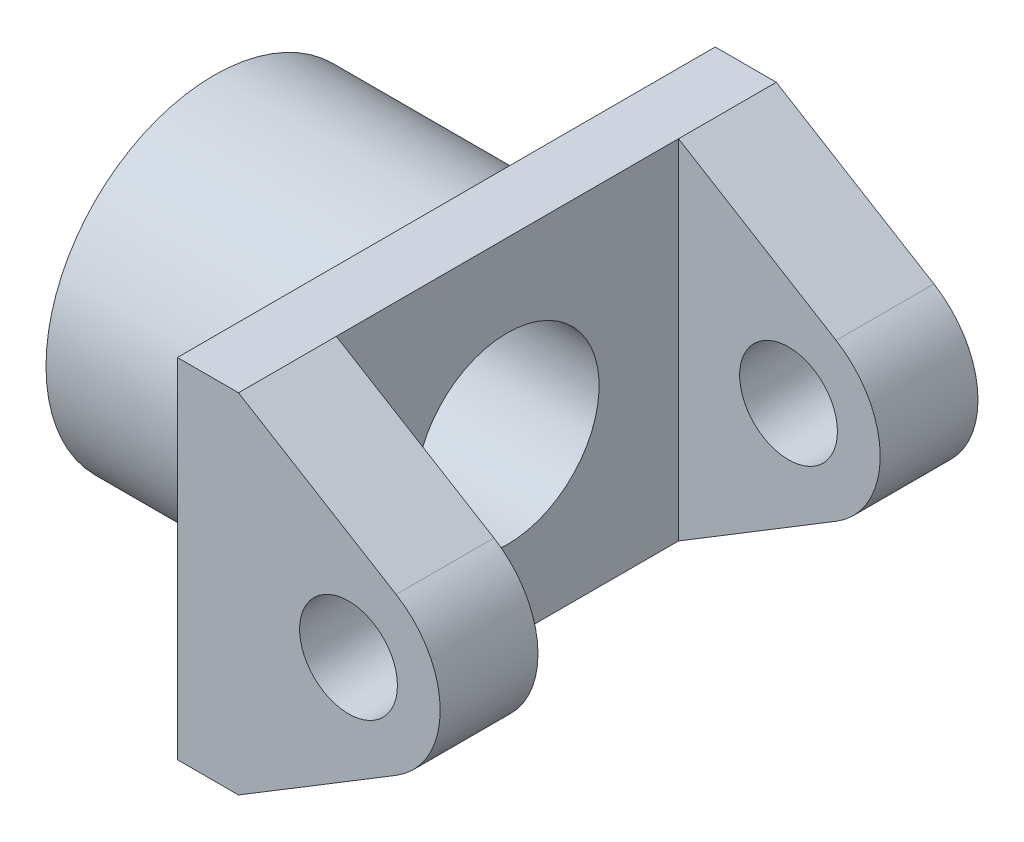
ISO-10303-21;
HEADER;
FILE_DESCRIPTION(('STEP AP214'),'2;1');
FILE_NAME('part.step','',(''),(''),'','','');
FILE_SCHEMA(('AUTOMOTIVE_DESIGN { 1 0 10303 214 1 1 1 1 }'));
ENDSEC;
DATA;
#1=APPLICATION_CONTEXT('core data for automotive mechanical design processes');
#2=APPLICATION_PROTOCOL_DEFINITION('international standard','automotive_design',2000,#1);
#3=PRODUCT_CONTEXT('',#1,'mechanical');
#4=PRODUCT('Part','Part','',(#3));
#5=PRODUCT_RELATED_PRODUCT_CATEGORY('part','',(#4));
#6=PRODUCT_DEFINITION_FORMATION('','',#4);
#7=PRODUCT_DEFINITION_CONTEXT('part definition',#1,'design');
#8=PRODUCT_DEFINITION('design','',#6,#7);
#9=PRODUCT_DEFINITION_SHAPE('','',#8);
#10=(LENGTH_UNIT() NAMED_UNIT(*) SI_UNIT(.MILLI.,.METRE.));
#11=(NAMED_UNIT(*) PLANE_ANGLE_UNIT() SI_UNIT($,.RADIAN.));
#12=(NAMED_UNIT(*) SI_UNIT($,.STERADIAN.) SOLID_ANGLE_UNIT());
#13=UNCERTAINTY_MEASURE_WITH_UNIT(LENGTH_MEASURE(1.E-05),#10,'distance_accuracy_value','');
#14=(GEOMETRIC_REPRESENTATION_CONTEXT(3) GLOBAL_UNCERTAINTY_ASSIGNED_CONTEXT((#13)) GLOBAL_UNIT_ASSIGNED_CONTEXT((#10,
#11,#12)) REPRESENTATION_CONTEXT('',''));
#15=CARTESIAN_POINT('',(0.,0.,0.));
#16=DIRECTION('',(0.,0.,1.));
#17=DIRECTION('',(1.,0.,0.));
#18=AXIS2_PLACEMENT_3D('',#15,#16,#17);
#19=CARTESIAN_POINT('',(-28.,0.,-16.));
#20=DIRECTION('',(-1.,0.,0.));
#21=DIRECTION('',(0.,0.,1.));
#22=AXIS2_PLACEMENT_3D('',#19,#20,#21);
#23=PLANE('',#22);
#24=DIRECTION('',(0.,0.,1.));
#25=VECTOR('',#24,1.);
#26=CARTESIAN_POINT('',(-28.,-28.5,-16.));
#27=LINE('',#26,#25);
#28=CARTESIAN_POINT('',(-28.,-28.5,-16.));
#29=VERTEX_POINT('',#28);
#30=CARTESIAN_POINT('',(-28.,-28.5,72.));
#31=VERTEX_POINT('',#30);
#32=EDGE_CURVE('E113',#29,#31,#27,.T.);
#33=ORIENTED_EDGE('',*,*,#32,.T.);
#34=DIRECTION('',(0.,1.,0.));
#35=VECTOR('',#34,1.);
#36=CARTESIAN_POINT('',(-28.,28.5,72.));
#37=LINE('',#36,#35);
#38=CARTESIAN_POINT('',(-28.,28.5,72.));
#39=VERTEX_POINT('',#38);
#40=EDGE_CURVE('E109',#31,#39,#37,.T.);
#41=ORIENTED_EDGE('',*,*,#40,.T.);
#42=DIRECTION('',(0.,0.,1.));
#43=VECTOR('',#42,1.);
#44=CARTESIAN_POINT('',(-28.,28.5,-16.));
#45=LINE('',#44,#43);
#46=CARTESIAN_POINT('',(-28.,28.5,-16.));
#47=VERTEX_POINT('',#46);
#48=EDGE_CURVE('E101',#47,#39,#45,.T.);
#49=ORIENTED_EDGE('',*,*,#48,.F.);
#50=DIRECTION('',(0.,-1.,0.));
#51=VECTOR('',#50,1.);
#52=CARTESIAN_POINT('',(-28.,0.,-16.));
#53=LINE('',#52,#51);
#54=EDGE_CURVE('E106',#47,#29,#53,.T.);
#55=ORIENTED_EDGE('',*,*,#54,.T.);
#56=EDGE_LOOP('',(#33,#41,#49,#55));
#57=FACE_BOUND('',#56,.T.);
#58=CARTESIAN_POINT('',(-28.,0.,28.));
#59=DIRECTION('',(-1.,0.,0.));
#60=DIRECTION('',(0.,0.,1.));
#61=AXIS2_PLACEMENT_3D('',#58,#59,#60);
#62=CIRCLE('',#61,27.5);
#63=CARTESIAN_POINT('',(-28.,0.,55.5));
#64=VERTEX_POINT('',#63);
#65=EDGE_CURVE('E245',#64,#64,#62,.T.);
#66=ORIENTED_EDGE('',*,*,#65,.F.);
#67=EDGE_LOOP('',(#66));
#68=FACE_BOUND('',#67,.T.);
#69=ADVANCED_FACE('F35',(#57,#68),#23,.T.);
#70=CARTESIAN_POINT('',(-18.,0.,0.));
#71=DIRECTION('',(-1.,0.,0.));
#72=DIRECTION('',(0.,0.,1.));
#73=AXIS2_PLACEMENT_3D('',#70,#71,#72);
#74=PLANE('',#73);
#75=CARTESIAN_POINT('',(-18.,0.,28.));
#76=DIRECTION('',(1.,0.,0.));
#77=DIRECTION('',(0.,0.,-1.));
#78=AXIS2_PLACEMENT_3D('',#75,#76,#77);
#79=CIRCLE('',#78,15.);
#80=CARTESIAN_POINT('',(-18.,-4.,42.456832294801));
#81=VERTEX_POINT('',#80);
#82=CARTESIAN_POINT('',(-18.,4.,42.456832294801));
#83=VERTEX_POINT('',#82);
#84=EDGE_CURVE('E326',#81,#83,#79,.T.);
#85=ORIENTED_EDGE('',*,*,#84,.F.);
#86=DIRECTION('',(0.,0.,-1.));
#87=VECTOR('',#86,1.);
#88=CARTESIAN_POINT('',(-18.,-4.,42.456832294801));
#89=LINE('',#88,#87);
#90=CARTESIAN_POINT('',(-18.,-4.,47.));
#91=VERTEX_POINT('',#90);
#92=EDGE_CURVE('E329',#91,#81,#89,.T.);
#93=ORIENTED_EDGE('',*,*,#92,.F.);
#94=DIRECTION('',(0.,-1.,0.));
#95=VECTOR('',#94,1.);
#96=CARTESIAN_POINT('',(-18.,-4.,47.));
#97=LINE('',#96,#95);
#98=CARTESIAN_POINT('',(-18.,4.,47.));
#99=VERTEX_POINT('',#98);
#100=EDGE_CURVE('E332',#99,#91,#97,.T.);
#101=ORIENTED_EDGE('',*,*,#100,.F.);
#102=DIRECTION('',(0.,0.,1.));
#103=VECTOR('',#102,1.);
#104=CARTESIAN_POINT('',(-18.,4.,47.));
#105=LINE('',#104,#103);
#106=EDGE_CURVE('E318',#83,#99,#105,.T.);
#107=ORIENTED_EDGE('',*,*,#106,.F.);
#108=EDGE_LOOP('',(#85,#93,#101,#107));
#109=FACE_BOUND('',#108,.T.);
#110=DIRECTION('',(0.,-1.,0.));
#111=VECTOR('',#110,1.);
#112=CARTESIAN_POINT('',(-18.,28.5,56.));
#113=LINE('',#112,#111);
#114=CARTESIAN_POINT('',(-18.,28.5,56.));
#115=VERTEX_POINT('',#114);
#116=CARTESIAN_POINT('',(-18.,-28.5,56.));
#117=VERTEX_POINT('',#116);
#118=EDGE_CURVE('E209',#115,#117,#113,.T.);
#119=ORIENTED_EDGE('',*,*,#118,.T.);
#120=DIRECTION('',(0.,0.,1.));
#121=VECTOR('',#120,1.);
#122=CARTESIAN_POINT('',(-18.,-28.5,-16.));
#123=LINE('',#122,#121);
#124=CARTESIAN_POINT('',(-18.,-28.5,0.));
#125=VERTEX_POINT('',#124);
#126=EDGE_CURVE('E206',#125,#117,#123,.T.);
#127=ORIENTED_EDGE('',*,*,#126,.F.);
#128=DIRECTION('',(0.,-1.,0.));
#129=VECTOR('',#128,1.);
#130=CARTESIAN_POINT('',(-18.,0.,0.));
#131=LINE('',#130,#129);
#132=CARTESIAN_POINT('',(-18.,28.5,0.));
#133=VERTEX_POINT('',#132);
#134=EDGE_CURVE('E11',#133,#125,#131,.T.);
#135=ORIENTED_EDGE('',*,*,#134,.F.);
#136=DIRECTION('',(0.,0.,-1.));
#137=VECTOR('',#136,1.);
#138=CARTESIAN_POINT('',(-18.,28.5,-16.));
#139=LINE('',#138,#137);
#140=EDGE_CURVE('E203',#115,#133,#139,.T.);
#141=ORIENTED_EDGE('',*,*,#140,.F.);
#142=EDGE_LOOP('',(#119,#127,#135,#141));
#143=FACE_BOUND('',#142,.T.);
#144=ADVANCED_FACE('F156',(#109,#143),#74,.F.);
#145=CARTESIAN_POINT('',(0.,0.,0.));
#146=DIRECTION('',(0.,0.,1.));
#147=DIRECTION('',(1.,0.,0.));
#148=AXIS2_PLACEMENT_3D('',#145,#146,#147);
#149=PLANE('',#148);
#150=CARTESIAN_POINT('',(0.,0.,0.));
#151=DIRECTION('',(0.,0.,1.));
#152=DIRECTION('',(1.,0.,0.));
#153=AXIS2_PLACEMENT_3D('',#150,#151,#152);
#154=CIRCLE('',#153,8.);
#155=CARTESIAN_POINT('',(8.,0.,0.));
#156=VERTEX_POINT('',#155);
#157=EDGE_CURVE('E132',#156,#156,#154,.T.);
#158=ORIENTED_EDGE('',*,*,#157,.F.);
#159=EDGE_LOOP('',(#158));
#160=FACE_BOUND('',#159,.T.);
#161=DIRECTION('',(0.854446220930648,-0.519539849806859,0.));
#162=VECTOR('',#161,1.);
#163=CARTESIAN_POINT('',(7.79309774710289,12.8166933139597,0.));
#164=LINE('',#163,#162);
#165=CARTESIAN_POINT('',(7.79309774710289,12.8166933139597,0.));
#166=VERTEX_POINT('',#165);
#167=EDGE_CURVE('E141',#133,#166,#164,.T.);
#168=ORIENTED_EDGE('',*,*,#167,.F.);
#169=ORIENTED_EDGE('',*,*,#134,.T.);
#170=DIRECTION('',(0.854446220930648,0.51953984980686,0.));
#171=VECTOR('',#170,1.);
#172=CARTESIAN_POINT('',(7.79309774710289,-12.8166933139597,0.));
#173=LINE('',#172,#171);
#174=CARTESIAN_POINT('',(7.79309774710289,-12.8166933139597,0.));
#175=VERTEX_POINT('',#174);
#176=EDGE_CURVE('E135',#125,#175,#173,.T.);
#177=ORIENTED_EDGE('',*,*,#176,.T.);
#178=CARTESIAN_POINT('',(0.,0.,0.));
#179=DIRECTION('',(0.,0.,1.));
#180=DIRECTION('',(1.,0.,0.));
#181=AXIS2_PLACEMENT_3D('',#178,#179,#180);
#182=CIRCLE('',#181,15.);
#183=EDGE_CURVE('E138',#175,#166,#182,.T.);
#184=ORIENTED_EDGE('',*,*,#183,.T.);
#185=EDGE_LOOP('',(#168,#169,#177,#184));
#186=FACE_BOUND('',#185,.T.);
#187=ADVANCED_FACE('F154',(#160,#186),#149,.T.);
#188=CARTESIAN_POINT('',(7.79309774710289,-12.8166933139597,-16.));
#189=DIRECTION('',(0.51953984980686,-0.854446220930648,0.));
#190=DIRECTION('',(0.854446220930648,0.51953984980686,0.));
#191=AXIS2_PLACEMENT_3D('',#188,#189,#190);
#192=PLANE('',#191);
#193=ORIENTED_EDGE('',*,*,#176,.F.);
#194=DIRECTION('',(0.,0.,1.));
#195=VECTOR('',#194,1.);
#196=CARTESIAN_POINT('',(-18.,-28.5,-16.));
#197=LINE('',#196,#195);
#198=CARTESIAN_POINT('',(-18.,-28.5,-16.));
#199=VERTEX_POINT('',#198);
#200=EDGE_CURVE('E43',#199,#125,#197,.T.);
#201=ORIENTED_EDGE('',*,*,#200,.F.);
#202=DIRECTION('',(0.854446220930648,0.51953984980686,0.));
#203=VECTOR('',#202,1.);
#204=CARTESIAN_POINT('',(7.79309774710289,-12.8166933139597,-16.));
#205=LINE('',#204,#203);
#206=CARTESIAN_POINT('',(7.79309774710289,-12.8166933139597,-16.));
#207=VERTEX_POINT('',#206);
#208=EDGE_CURVE('E151',#199,#207,#205,.T.);
#209=ORIENTED_EDGE('',*,*,#208,.T.);
#210=DIRECTION('',(0.,0.,1.));
#211=VECTOR('',#210,1.);
#212=CARTESIAN_POINT('',(7.79309774710289,-12.8166933139597,-16.));
#213=LINE('',#212,#211);
#214=EDGE_CURVE('E86',#207,#175,#213,.T.);
#215=ORIENTED_EDGE('',*,*,#214,.T.);
#216=EDGE_LOOP('',(#193,#201,#209,#215));
#217=FACE_BOUND('',#216,.T.);
#218=ADVANCED_FACE('F149',(#217),#192,.T.);
#219=CARTESIAN_POINT('',(0.,-28.5,-16.));
#220=DIRECTION('',(0.,-1.,0.));
#221=DIRECTION('',(1.,0.,0.));
#222=AXIS2_PLACEMENT_3D('',#219,#220,#221);
#223=PLANE('',#222);
#224=ORIENTED_EDGE('',*,*,#200,.T.);
#225=ORIENTED_EDGE('',*,*,#126,.T.);
#226=DIRECTION('',(0.,0.,1.));
#227=VECTOR('',#226,1.);
#228=CARTESIAN_POINT('',(-18.,-28.5,56.));
#229=LINE('',#228,#227);
#230=CARTESIAN_POINT('',(-18.,-28.5,72.));
#231=VERTEX_POINT('',#230);
#232=EDGE_CURVE('E227',#117,#231,#229,.T.);
#233=ORIENTED_EDGE('',*,*,#232,.T.);
#234=DIRECTION('',(-1.,0.,0.));
#235=VECTOR('',#234,1.);
#236=CARTESIAN_POINT('',(-18.,-28.5,72.));
#237=LINE('',#236,#235);
#238=EDGE_CURVE('E196',#231,#31,#237,.T.);
#239=ORIENTED_EDGE('',*,*,#238,.T.);
#240=ORIENTED_EDGE('',*,*,#32,.F.);
#241=DIRECTION('',(1.,0.,0.));
#242=VECTOR('',#241,1.);
#243=CARTESIAN_POINT('',(0.,-28.5,-16.));
#244=LINE('',#243,#242);
#245=EDGE_CURVE('E127',#29,#199,#244,.T.);
#246=ORIENTED_EDGE('',*,*,#245,.T.);
#247=EDGE_LOOP('',(#224,#225,#233,#239,#240,#246));
#248=FACE_BOUND('',#247,.T.);
#249=ADVANCED_FACE('F163',(#248),#223,.T.);
#250=CARTESIAN_POINT('',(0.,28.5,-16.));
#251=DIRECTION('',(0.,-1.,0.));
#252=DIRECTION('',(0.,0.,-1.));
#253=AXIS2_PLACEMENT_3D('',#250,#251,#252);
#254=PLANE('',#253);
#255=ORIENTED_EDGE('',*,*,#48,.T.);
#256=DIRECTION('',(-1.,0.,0.));
#257=VECTOR('',#256,1.);
#258=CARTESIAN_POINT('',(-18.,28.5,72.));
#259=LINE('',#258,#257);
#260=CARTESIAN_POINT('',(-18.,28.5,72.));
#261=VERTEX_POINT('',#260);
#262=EDGE_CURVE('E136',#261,#39,#259,.T.);
#263=ORIENTED_EDGE('',*,*,#262,.F.);
#264=EDGE_CURVE('E213',#261,#115,#139,.T.);
#265=ORIENTED_EDGE('',*,*,#264,.T.);
#266=ORIENTED_EDGE('',*,*,#140,.T.);
#267=DIRECTION('',(0.,0.,1.));
#268=VECTOR('',#267,1.);
#269=CARTESIAN_POINT('',(-18.,28.5,-16.));
#270=LINE('',#269,#268);
#271=CARTESIAN_POINT('',(-18.,28.5,-16.));
#272=VERTEX_POINT('',#271);
#273=EDGE_CURVE('E114',#272,#133,#270,.T.);
#274=ORIENTED_EDGE('',*,*,#273,.F.);
#275=DIRECTION('',(1.,0.,0.));
#276=VECTOR('',#275,1.);
#277=CARTESIAN_POINT('',(0.,28.5,-16.));
#278=LINE('',#277,#276);
#279=EDGE_CURVE('E118',#47,#272,#278,.T.);
#280=ORIENTED_EDGE('',*,*,#279,.F.);
#281=EDGE_LOOP('',(#255,#263,#265,#266,#274,#280));
#282=FACE_BOUND('',#281,.T.);
#283=ADVANCED_FACE('F119',(#282),#254,.F.);
#284=CARTESIAN_POINT('',(7.79309774710289,12.8166933139597,-16.));
#285=DIRECTION('',(-0.519539849806859,-0.854446220930648,0.));
#286=DIRECTION('',(0.854446220930648,-0.519539849806859,0.));
#287=AXIS2_PLACEMENT_3D('',#284,#285,#286);
#288=PLANE('',#287);
#289=ORIENTED_EDGE('',*,*,#167,.T.);
#290=DIRECTION('',(0.,0.,1.));
#291=VECTOR('',#290,1.);
#292=CARTESIAN_POINT('',(7.79309774710289,12.8166933139597,-16.));
#293=LINE('',#292,#291);
#294=CARTESIAN_POINT('',(7.79309774710289,12.8166933139597,-16.));
#295=VERTEX_POINT('',#294);
#296=EDGE_CURVE('E148',#295,#166,#293,.T.);
#297=ORIENTED_EDGE('',*,*,#296,.F.);
#298=DIRECTION('',(0.854446220930648,-0.519539849806859,0.));
#299=VECTOR('',#298,1.);
#300=CARTESIAN_POINT('',(7.79309774710289,12.8166933139597,-16.));
#301=LINE('',#300,#299);
#302=EDGE_CURVE('E122',#272,#295,#301,.T.);
#303=ORIENTED_EDGE('',*,*,#302,.F.);
#304=ORIENTED_EDGE('',*,*,#273,.T.);
#305=EDGE_LOOP('',(#289,#297,#303,#304));
#306=FACE_BOUND('',#305,.T.);
#307=ADVANCED_FACE('F176',(#306),#288,.F.);
#308=CARTESIAN_POINT('',(0.,0.,-16.));
#309=DIRECTION('',(0.,0.,1.));
#310=DIRECTION('',(1.,0.,0.));
#311=AXIS2_PLACEMENT_3D('',#308,#309,#310);
#312=CYLINDRICAL_SURFACE('',#311,8.);
#313=CARTESIAN_POINT('',(0.,0.,-16.));
#314=DIRECTION('',(0.,0.,1.));
#315=DIRECTION('',(1.,0.,0.));
#316=AXIS2_PLACEMENT_3D('',#313,#314,#315);
#317=CIRCLE('',#316,8.);
#318=CARTESIAN_POINT('',(8.,0.,-16.));
#319=VERTEX_POINT('',#318);
#320=EDGE_CURVE('E144',#319,#319,#317,.T.);
#321=ORIENTED_EDGE('',*,*,#320,.F.);
#322=EDGE_LOOP('',(#321));
#323=FACE_BOUND('',#322,.T.);
#324=ORIENTED_EDGE('',*,*,#157,.T.);
#325=EDGE_LOOP('',(#324));
#326=FACE_BOUND('',#325,.T.);
#327=ADVANCED_FACE('F37',(#323,#326),#312,.F.);
#328=CARTESIAN_POINT('',(0.,0.,-16.));
#329=DIRECTION('',(0.,0.,1.));
#330=DIRECTION('',(1.,0.,0.));
#331=AXIS2_PLACEMENT_3D('',#328,#329,#330);
#332=CYLINDRICAL_SURFACE('',#331,15.);
#333=ORIENTED_EDGE('',*,*,#183,.F.);
#334=ORIENTED_EDGE('',*,*,#214,.F.);
#335=CARTESIAN_POINT('',(0.,0.,-16.));
#336=DIRECTION('',(0.,0.,1.));
#337=DIRECTION('',(1.,0.,0.));
#338=AXIS2_PLACEMENT_3D('',#335,#336,#337);
#339=CIRCLE('',#338,15.);
#340=EDGE_CURVE('E193',#207,#295,#339,.T.);
#341=ORIENTED_EDGE('',*,*,#340,.T.);
#342=ORIENTED_EDGE('',*,*,#296,.T.);
#343=EDGE_LOOP('',(#333,#334,#341,#342));
#344=FACE_BOUND('',#343,.T.);
#345=ADVANCED_FACE('F152',(#344),#332,.T.);
#346=CARTESIAN_POINT('',(0.,0.,-16.));
#347=DIRECTION('',(0.,0.,1.));
#348=DIRECTION('',(1.,0.,0.));
#349=AXIS2_PLACEMENT_3D('',#346,#347,#348);
#350=PLANE('',#349);
#351=ORIENTED_EDGE('',*,*,#279,.T.);
#352=ORIENTED_EDGE('',*,*,#302,.T.);
#353=ORIENTED_EDGE('',*,*,#340,.F.);
#354=ORIENTED_EDGE('',*,*,#208,.F.);
#355=ORIENTED_EDGE('',*,*,#245,.F.);
#356=ORIENTED_EDGE('',*,*,#54,.F.);
#357=EDGE_LOOP('',(#351,#352,#353,#354,#355,#356));
#358=FACE_BOUND('',#357,.T.);
#359=ORIENTED_EDGE('',*,*,#320,.T.);
#360=EDGE_LOOP('',(#359));
#361=FACE_BOUND('',#360,.T.);
#362=ADVANCED_FACE('F124',(#358,#361),#350,.F.);
#363=CARTESIAN_POINT('',(-18.,28.5,72.));
#364=DIRECTION('',(0.,0.,1.));
#365=DIRECTION('',(0.,-1.,0.));
#366=AXIS2_PLACEMENT_3D('',#363,#364,#365);
#367=PLANE('',#366);
#368=ORIENTED_EDGE('',*,*,#40,.F.);
#369=ORIENTED_EDGE('',*,*,#238,.F.);
#370=DIRECTION('',(0.854446220930648,0.51953984980686,0.));
#371=VECTOR('',#370,1.);
#372=CARTESIAN_POINT('',(-18.,-28.5,72.));
#373=LINE('',#372,#371);
#374=CARTESIAN_POINT('',(7.79309774710289,-12.8166933139597,72.));
#375=VERTEX_POINT('',#374);
#376=EDGE_CURVE('E253',#231,#375,#373,.T.);
#377=ORIENTED_EDGE('',*,*,#376,.T.);
#378=CARTESIAN_POINT('',(0.,0.,72.));
#379=DIRECTION('',(0.,0.,1.));
#380=DIRECTION('',(1.,0.,0.));
#381=AXIS2_PLACEMENT_3D('',#378,#379,#380);
#382=CIRCLE('',#381,15.);
#383=CARTESIAN_POINT('',(7.79309774710289,12.8166933139597,72.));
#384=VERTEX_POINT('',#383);
#385=EDGE_CURVE('E242',#375,#384,#382,.T.);
#386=ORIENTED_EDGE('',*,*,#385,.T.);
#387=DIRECTION('',(-0.854446220930648,0.519539849806859,0.));
#388=VECTOR('',#387,1.);
#389=CARTESIAN_POINT('',(7.79309774710289,12.8166933139597,72.));
#390=LINE('',#389,#388);
#391=EDGE_CURVE('E262',#384,#261,#390,.T.);
#392=ORIENTED_EDGE('',*,*,#391,.T.);
#393=ORIENTED_EDGE('',*,*,#262,.T.);
#394=EDGE_LOOP('',(#368,#369,#377,#386,#392,#393));
#395=FACE_BOUND('',#394,.T.);
#396=CARTESIAN_POINT('',(0.,0.,72.));
#397=DIRECTION('',(0.,0.,1.));
#398=DIRECTION('',(1.,0.,0.));
#399=AXIS2_PLACEMENT_3D('',#396,#397,#398);
#400=CIRCLE('',#399,8.);
#401=CARTESIAN_POINT('',(8.,0.,72.));
#402=VERTEX_POINT('',#401);
#403=EDGE_CURVE('E236',#402,#402,#400,.T.);
#404=ORIENTED_EDGE('',*,*,#403,.F.);
#405=EDGE_LOOP('',(#404));
#406=FACE_BOUND('',#405,.T.);
#407=ADVANCED_FACE('F185',(#395,#406),#367,.T.);
#408=CARTESIAN_POINT('',(0.,0.,56.));
#409=DIRECTION('',(0.,0.,1.));
#410=DIRECTION('',(1.,0.,0.));
#411=AXIS2_PLACEMENT_3D('',#408,#409,#410);
#412=CYLINDRICAL_SURFACE('',#411,15.);
#413=ORIENTED_EDGE('',*,*,#385,.F.);
#414=DIRECTION('',(0.,0.,1.));
#415=VECTOR('',#414,1.);
#416=CARTESIAN_POINT('',(7.79309774710289,-12.8166933139597,56.));
#417=LINE('',#416,#415);
#418=CARTESIAN_POINT('',(7.79309774710289,-12.8166933139597,56.));
#419=VERTEX_POINT('',#418);
#420=EDGE_CURVE('E215',#419,#375,#417,.T.);
#421=ORIENTED_EDGE('',*,*,#420,.F.);
#422=CARTESIAN_POINT('',(0.,0.,56.));
#423=DIRECTION('',(0.,0.,1.));
#424=DIRECTION('',(1.,0.,0.));
#425=AXIS2_PLACEMENT_3D('',#422,#423,#424);
#426=CIRCLE('',#425,15.);
#427=CARTESIAN_POINT('',(7.79309774710289,12.8166933139597,56.));
#428=VERTEX_POINT('',#427);
#429=EDGE_CURVE('E249',#419,#428,#426,.T.);
#430=ORIENTED_EDGE('',*,*,#429,.T.);
#431=DIRECTION('',(0.,0.,1.));
#432=VECTOR('',#431,1.);
#433=CARTESIAN_POINT('',(7.79309774710289,12.8166933139597,56.));
#434=LINE('',#433,#432);
#435=EDGE_CURVE('E218',#428,#384,#434,.T.);
#436=ORIENTED_EDGE('',*,*,#435,.T.);
#437=EDGE_LOOP('',(#413,#421,#430,#436));
#438=FACE_BOUND('',#437,.T.);
#439=ADVANCED_FACE('F232',(#438),#412,.T.);
#440=CARTESIAN_POINT('',(-18.,-28.5,56.));
#441=DIRECTION('',(0.51953984980686,-0.854446220930648,0.));
#442=DIRECTION('',(0.854446220930648,0.51953984980686,0.));
#443=AXIS2_PLACEMENT_3D('',#440,#441,#442);
#444=PLANE('',#443);
#445=ORIENTED_EDGE('',*,*,#376,.F.);
#446=ORIENTED_EDGE('',*,*,#232,.F.);
#447=DIRECTION('',(0.854446220930648,0.51953984980686,0.));
#448=VECTOR('',#447,1.);
#449=CARTESIAN_POINT('',(-18.,-28.5,56.));
#450=LINE('',#449,#448);
#451=EDGE_CURVE('E257',#117,#419,#450,.T.);
#452=ORIENTED_EDGE('',*,*,#451,.T.);
#453=ORIENTED_EDGE('',*,*,#420,.T.);
#454=EDGE_LOOP('',(#445,#446,#452,#453));
#455=FACE_BOUND('',#454,.T.);
#456=ADVANCED_FACE('F285',(#455),#444,.T.);
#457=CARTESIAN_POINT('',(7.79309774710289,12.8166933139597,56.));
#458=DIRECTION('',(0.519539849806859,0.854446220930648,0.));
#459=DIRECTION('',(-0.854446220930648,0.519539849806859,0.));
#460=AXIS2_PLACEMENT_3D('',#457,#458,#459);
#461=PLANE('',#460);
#462=ORIENTED_EDGE('',*,*,#391,.F.);
#463=ORIENTED_EDGE('',*,*,#435,.F.);
#464=DIRECTION('',(-0.854446220930648,0.519539849806859,0.));
#465=VECTOR('',#464,1.);
#466=CARTESIAN_POINT('',(7.79309774710289,12.8166933139597,56.));
#467=LINE('',#466,#465);
#468=EDGE_CURVE('E252',#428,#115,#467,.T.);
#469=ORIENTED_EDGE('',*,*,#468,.T.);
#470=ORIENTED_EDGE('',*,*,#264,.F.);
#471=EDGE_LOOP('',(#462,#463,#469,#470));
#472=FACE_BOUND('',#471,.T.);
#473=ADVANCED_FACE('F281',(#472),#461,.T.);
#474=CARTESIAN_POINT('',(0.,0.,56.));
#475=DIRECTION('',(0.,0.,1.));
#476=DIRECTION('',(1.,0.,0.));
#477=AXIS2_PLACEMENT_3D('',#474,#475,#476);
#478=PLANE('',#477);
#479=CARTESIAN_POINT('',(0.,0.,56.));
#480=DIRECTION('',(0.,0.,1.));
#481=DIRECTION('',(1.,0.,0.));
#482=AXIS2_PLACEMENT_3D('',#479,#480,#481);
#483=CIRCLE('',#482,8.);
#484=CARTESIAN_POINT('',(8.,0.,56.));
#485=VERTEX_POINT('',#484);
#486=EDGE_CURVE('E238',#485,#485,#483,.T.);
#487=ORIENTED_EDGE('',*,*,#486,.T.);
#488=EDGE_LOOP('',(#487));
#489=FACE_BOUND('',#488,.T.);
#490=ORIENTED_EDGE('',*,*,#429,.F.);
#491=ORIENTED_EDGE('',*,*,#451,.F.);
#492=ORIENTED_EDGE('',*,*,#118,.F.);
#493=ORIENTED_EDGE('',*,*,#468,.F.);
#494=EDGE_LOOP('',(#490,#491,#492,#493));
#495=FACE_BOUND('',#494,.T.);
#496=ADVANCED_FACE('F369',(#489,#495),#478,.F.);
#497=CARTESIAN_POINT('',(0.,0.,56.));
#498=DIRECTION('',(0.,0.,1.));
#499=DIRECTION('',(1.,0.,0.));
#500=AXIS2_PLACEMENT_3D('',#497,#498,#499);
#501=CYLINDRICAL_SURFACE('',#500,8.);
#502=ORIENTED_EDGE('',*,*,#486,.F.);
#503=EDGE_LOOP('',(#502));
#504=FACE_BOUND('',#503,.T.);
#505=ORIENTED_EDGE('',*,*,#403,.T.);
#506=EDGE_LOOP('',(#505));
#507=FACE_BOUND('',#506,.T.);
#508=ADVANCED_FACE('F362',(#504,#507),#501,.F.);
#509=CARTESIAN_POINT('',(-66.,0.,28.));
#510=DIRECTION('',(-1.,0.,0.));
#511=DIRECTION('',(0.,0.,1.));
#512=AXIS2_PLACEMENT_3D('',#509,#510,#511);
#513=PLANE('',#512);
#514=CARTESIAN_POINT('',(-66.,0.,28.));
#515=DIRECTION('',(-1.,0.,0.));
#516=DIRECTION('',(0.,0.,1.));
#517=AXIS2_PLACEMENT_3D('',#514,#515,#516);
#518=CIRCLE('',#517,27.5);
#519=CARTESIAN_POINT('',(-66.,0.,55.5));
#520=VERTEX_POINT('',#519);
#521=EDGE_CURVE('E239',#520,#520,#518,.T.);
#522=ORIENTED_EDGE('',*,*,#521,.T.);
#523=EDGE_LOOP('',(#522));
#524=FACE_BOUND('',#523,.T.);
#525=DIRECTION('',(0.,0.,1.));
#526=VECTOR('',#525,1.);
#527=CARTESIAN_POINT('',(-66.,-4.,47.));
#528=LINE('',#527,#526);
#529=CARTESIAN_POINT('',(-66.,-4.,42.456832294801));
#530=VERTEX_POINT('',#529);
#531=CARTESIAN_POINT('',(-66.,-4.,47.));
#532=VERTEX_POINT('',#531);
#533=EDGE_CURVE('E339',#530,#532,#528,.T.);
#534=ORIENTED_EDGE('',*,*,#533,.F.);
#535=CARTESIAN_POINT('',(-66.,0.,28.));
#536=DIRECTION('',(-1.,0.,0.));
#537=DIRECTION('',(0.,0.,1.));
#538=AXIS2_PLACEMENT_3D('',#535,#536,#537);
#539=CIRCLE('',#538,15.);
#540=CARTESIAN_POINT('',(-66.,4.,42.456832294801));
#541=VERTEX_POINT('',#540);
#542=EDGE_CURVE('E334',#541,#530,#539,.T.);
#543=ORIENTED_EDGE('',*,*,#542,.F.);
#544=DIRECTION('',(0.,0.,-1.));
#545=VECTOR('',#544,1.);
#546=CARTESIAN_POINT('',(-66.,4.,47.));
#547=LINE('',#546,#545);
#548=CARTESIAN_POINT('',(-66.,4.,47.));
#549=VERTEX_POINT('',#548);
#550=EDGE_CURVE('E321',#549,#541,#547,.T.);
#551=ORIENTED_EDGE('',*,*,#550,.F.);
#552=DIRECTION('',(0.,1.,0.));
#553=VECTOR('',#552,1.);
#554=CARTESIAN_POINT('',(-66.,4.,47.));
#555=LINE('',#554,#553);
#556=EDGE_CURVE('E341',#532,#549,#555,.T.);
#557=ORIENTED_EDGE('',*,*,#556,.F.);
#558=EDGE_LOOP('',(#534,#543,#551,#557));
#559=FACE_BOUND('',#558,.T.);
#560=ADVANCED_FACE('F353',(#524,#559),#513,.T.);
#561=CARTESIAN_POINT('',(-66.,0.,28.));
#562=DIRECTION('',(1.,0.,0.));
#563=DIRECTION('',(0.,0.,-1.));
#564=AXIS2_PLACEMENT_3D('',#561,#562,#563);
#565=CYLINDRICAL_SURFACE('',#564,27.5);
#566=ORIENTED_EDGE('',*,*,#521,.F.);
#567=EDGE_LOOP('',(#566));
#568=FACE_BOUND('',#567,.T.);
#569=ORIENTED_EDGE('',*,*,#65,.T.);
#570=EDGE_LOOP('',(#569));
#571=FACE_BOUND('',#570,.T.);
#572=ADVANCED_FACE('F351',(#568,#571),#565,.T.);
#573=CARTESIAN_POINT('',(-66.,0.,28.));
#574=DIRECTION('',(1.,0.,0.));
#575=DIRECTION('',(0.,0.,-1.));
#576=AXIS2_PLACEMENT_3D('',#573,#574,#575);
#577=CYLINDRICAL_SURFACE('',#576,15.);
#578=DIRECTION('',(1.,0.,0.));
#579=VECTOR('',#578,1.);
#580=CARTESIAN_POINT('',(-66.,-4.,42.456832294801));
#581=LINE('',#580,#579);
#582=EDGE_CURVE('E50',#530,#81,#581,.T.);
#583=ORIENTED_EDGE('',*,*,#582,.T.);
#584=ORIENTED_EDGE('',*,*,#84,.T.);
#585=DIRECTION('',(1.,0.,0.));
#586=VECTOR('',#585,1.);
#587=CARTESIAN_POINT('',(-66.,4.,42.456832294801));
#588=LINE('',#587,#586);
#589=EDGE_CURVE('E315',#541,#83,#588,.T.);
#590=ORIENTED_EDGE('',*,*,#589,.F.);
#591=ORIENTED_EDGE('',*,*,#542,.T.);
#592=EDGE_LOOP('',(#583,#584,#590,#591));
#593=FACE_BOUND('',#592,.T.);
#594=ADVANCED_FACE('F327',(#593),#577,.F.);
#595=CARTESIAN_POINT('',(-66.,-4.,47.));
#596=DIRECTION('',(0.,1.,0.));
#597=DIRECTION('',(0.,0.,1.));
#598=AXIS2_PLACEMENT_3D('',#595,#596,#597);
#599=PLANE('',#598);
#600=DIRECTION('',(1.,0.,0.));
#601=VECTOR('',#600,1.);
#602=CARTESIAN_POINT('',(-66.,-4.,47.));
#603=LINE('',#602,#601);
#604=EDGE_CURVE('E346',#532,#91,#603,.T.);
#605=ORIENTED_EDGE('',*,*,#604,.T.);
#606=ORIENTED_EDGE('',*,*,#92,.T.);
#607=ORIENTED_EDGE('',*,*,#582,.F.);
#608=ORIENTED_EDGE('',*,*,#533,.T.);
#609=EDGE_LOOP('',(#605,#606,#607,#608));
#610=FACE_BOUND('',#609,.T.);
#611=ADVANCED_FACE('F360',(#610),#599,.T.);
#612=CARTESIAN_POINT('',(-66.,4.,47.));
#613=DIRECTION('',(0.,0.,-1.));
#614=DIRECTION('',(-1.,0.,0.));
#615=AXIS2_PLACEMENT_3D('',#612,#613,#614);
#616=PLANE('',#615);
#617=DIRECTION('',(1.,0.,0.));
#618=VECTOR('',#617,1.);
#619=CARTESIAN_POINT('',(-66.,4.,47.));
#620=LINE('',#619,#618);
#621=EDGE_CURVE('E323',#549,#99,#620,.T.);
#622=ORIENTED_EDGE('',*,*,#621,.T.);
#623=ORIENTED_EDGE('',*,*,#100,.T.);
#624=ORIENTED_EDGE('',*,*,#604,.F.);
#625=ORIENTED_EDGE('',*,*,#556,.T.);
#626=EDGE_LOOP('',(#622,#623,#624,#625));
#627=FACE_BOUND('',#626,.T.);
#628=ADVANCED_FACE('F434',(#627),#616,.T.);
#629=CARTESIAN_POINT('',(-66.,4.,47.));
#630=DIRECTION('',(0.,-1.,0.));
#631=DIRECTION('',(0.,0.,-1.));
#632=AXIS2_PLACEMENT_3D('',#629,#630,#631);
#633=PLANE('',#632);
#634=ORIENTED_EDGE('',*,*,#589,.T.);
#635=ORIENTED_EDGE('',*,*,#106,.T.);
#636=ORIENTED_EDGE('',*,*,#621,.F.);
#637=ORIENTED_EDGE('',*,*,#550,.T.);
#638=EDGE_LOOP('',(#634,#635,#636,#637));
#639=FACE_BOUND('',#638,.T.);
#640=ADVANCED_FACE('F316',(#639),#633,.T.);
#641=CLOSED_SHELL('',(#69,#144,#187,#218,#249,#283,#307,#327,#345,#362,#407,#439,#456,#473,#496,
#508,#560,#572,#594,#611,#628,#640));
#642=MANIFOLD_SOLID_BREP('B2',#641);
#643=ADVANCED_BREP_SHAPE_REPRESENTATION('',(#18,#642),#14);
#644=SHAPE_DEFINITION_REPRESENTATION(#9,#643);
ENDSEC;
END-ISO-10303-21;
